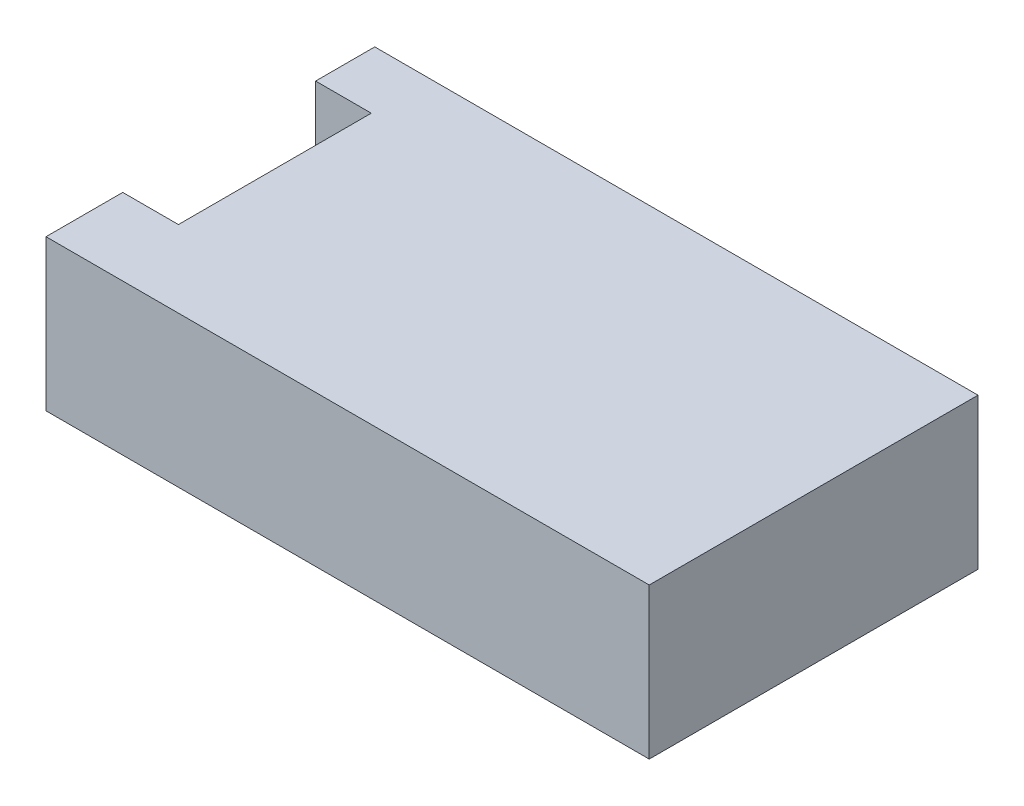
ISO-10303-21;
HEADER;
FILE_DESCRIPTION(('STEP AP214'),'2;1');
FILE_NAME('part.step','',(''),(''),'','','');
FILE_SCHEMA(('AUTOMOTIVE_DESIGN { 1 0 10303 214 1 1 1 1 }'));
ENDSEC;
DATA;
#1=APPLICATION_CONTEXT('core data for automotive mechanical design processes');
#2=APPLICATION_PROTOCOL_DEFINITION('international standard','automotive_design',2000,#1);
#3=PRODUCT_CONTEXT('',#1,'mechanical');
#4=PRODUCT('Part','Part','',(#3));
#5=PRODUCT_RELATED_PRODUCT_CATEGORY('part','',(#4));
#6=PRODUCT_DEFINITION_FORMATION('','',#4);
#7=PRODUCT_DEFINITION_CONTEXT('part definition',#1,'design');
#8=PRODUCT_DEFINITION('design','',#6,#7);
#9=PRODUCT_DEFINITION_SHAPE('','',#8);
#10=(LENGTH_UNIT() NAMED_UNIT(*) SI_UNIT(.MILLI.,.METRE.));
#11=(NAMED_UNIT(*) PLANE_ANGLE_UNIT() SI_UNIT($,.RADIAN.));
#12=(NAMED_UNIT(*) SI_UNIT($,.STERADIAN.) SOLID_ANGLE_UNIT());
#13=UNCERTAINTY_MEASURE_WITH_UNIT(LENGTH_MEASURE(1.E-05),#10,'distance_accuracy_value','');
#14=(GEOMETRIC_REPRESENTATION_CONTEXT(3) GLOBAL_UNCERTAINTY_ASSIGNED_CONTEXT((#13)) GLOBAL_UNIT_ASSIGNED_CONTEXT((#10,
#11,#12)) REPRESENTATION_CONTEXT('',''));
#15=CARTESIAN_POINT('',(0.,0.,0.));
#16=DIRECTION('',(0.,0.,1.));
#17=DIRECTION('',(1.,0.,0.));
#18=AXIS2_PLACEMENT_3D('',#15,#16,#17);
#19=CARTESIAN_POINT('',(13.048653616812,16.,14.7345241225469));
#20=DIRECTION('',(1.,0.,0.));
#21=DIRECTION('',(0.,0.,-1.));
#22=AXIS2_PLACEMENT_3D('',#19,#20,#21);
#23=PLANE('',#22);
#24=DIRECTION('',(0.,1.,0.));
#25=VECTOR('',#24,1.);
#26=CARTESIAN_POINT('',(13.048653616812,16.,68.1606571286871));
#27=LINE('',#26,#25);
#28=CARTESIAN_POINT('',(13.048653616812,16.,68.1606571286871));
#29=VERTEX_POINT('',#28);
#30=CARTESIAN_POINT('',(13.048653616812,21.,68.1606571286871));
#31=VERTEX_POINT('',#30);
#32=EDGE_CURVE('E230',#29,#31,#27,.T.);
#33=ORIENTED_EDGE('',*,*,#32,.F.);
#34=DIRECTION('',(0.,0.,-1.));
#35=VECTOR('',#34,1.);
#36=CARTESIAN_POINT('',(13.048653616812,16.,14.7345241225469));
#37=LINE('',#36,#35);
#38=CARTESIAN_POINT('',(13.048653616812,16.,78.6790460731446));
#39=VERTEX_POINT('',#38);
#40=EDGE_CURVE('E404',#39,#29,#37,.T.);
#41=ORIENTED_EDGE('',*,*,#40,.F.);
#42=DIRECTION('',(0.,1.,0.));
#43=VECTOR('',#42,1.);
#44=CARTESIAN_POINT('',(13.048653616812,16.,78.6790460731446));
#45=LINE('',#44,#43);
#46=CARTESIAN_POINT('',(13.048653616812,50.,78.6790460731446));
#47=VERTEX_POINT('',#46);
#48=EDGE_CURVE('E432',#39,#47,#45,.T.);
#49=ORIENTED_EDGE('',*,*,#48,.T.);
#50=DIRECTION('',(0.,0.,-1.));
#51=VECTOR('',#50,1.);
#52=CARTESIAN_POINT('',(13.048653616812,50.,14.7345241225469));
#53=LINE('',#52,#51);
#54=CARTESIAN_POINT('',(13.048653616812,50.,14.7345241225469));
#55=VERTEX_POINT('',#54);
#56=EDGE_CURVE('E417',#47,#55,#53,.T.);
#57=ORIENTED_EDGE('',*,*,#56,.T.);
#58=DIRECTION('',(0.,1.,0.));
#59=VECTOR('',#58,1.);
#60=CARTESIAN_POINT('',(13.048653616812,16.,14.7345241225469));
#61=LINE('',#60,#59);
#62=CARTESIAN_POINT('',(13.048653616812,16.,14.7345241225469));
#63=VERTEX_POINT('',#62);
#64=EDGE_CURVE('E429',#63,#55,#61,.T.);
#65=ORIENTED_EDGE('',*,*,#64,.F.);
#66=CARTESIAN_POINT('',(13.048653616812,16.,22.5222683426551));
#67=VERTEX_POINT('',#66);
#68=EDGE_CURVE('E403',#67,#63,#37,.T.);
#69=ORIENTED_EDGE('',*,*,#68,.F.);
#70=DIRECTION('',(0.,-1.,0.));
#71=VECTOR('',#70,1.);
#72=CARTESIAN_POINT('',(13.048653616812,16.,22.5222683426551));
#73=LINE('',#72,#71);
#74=CARTESIAN_POINT('',(13.048653616812,21.,22.5222683426551));
#75=VERTEX_POINT('',#74);
#76=EDGE_CURVE('E387',#75,#67,#73,.T.);
#77=ORIENTED_EDGE('',*,*,#76,.F.);
#78=DIRECTION('',(0.,0.,1.));
#79=VECTOR('',#78,1.);
#80=CARTESIAN_POINT('',(13.048653616812,21.,14.7345241225469));
#81=LINE('',#80,#79);
#82=CARTESIAN_POINT('',(13.048653616812,21.,28.1606571286872));
#83=VERTEX_POINT('',#82);
#84=EDGE_CURVE('E483',#75,#83,#81,.T.);
#85=ORIENTED_EDGE('',*,*,#84,.T.);
#86=DIRECTION('',(0.,1.,0.));
#87=VECTOR('',#86,1.);
#88=CARTESIAN_POINT('',(13.048653616812,16.,28.1606571286872));
#89=LINE('',#88,#87);
#90=CARTESIAN_POINT('',(13.048653616812,16.,28.1606571286872));
#91=VERTEX_POINT('',#90);
#92=EDGE_CURVE('E390',#91,#83,#89,.T.);
#93=ORIENTED_EDGE('',*,*,#92,.F.);
#94=CARTESIAN_POINT('',(13.048653616812,16.,32.5222683426551));
#95=VERTEX_POINT('',#94);
#96=EDGE_CURVE('E519',#95,#91,#37,.T.);
#97=ORIENTED_EDGE('',*,*,#96,.F.);
#98=DIRECTION('',(0.,-1.,0.));
#99=VECTOR('',#98,1.);
#100=CARTESIAN_POINT('',(13.048653616812,16.,32.5222683426551));
#101=LINE('',#100,#99);
#102=CARTESIAN_POINT('',(13.048653616812,21.,32.5222683426551));
#103=VERTEX_POINT('',#102);
#104=EDGE_CURVE('E357',#103,#95,#101,.T.);
#105=ORIENTED_EDGE('',*,*,#104,.F.);
#106=DIRECTION('',(0.,0.,1.));
#107=VECTOR('',#106,1.);
#108=CARTESIAN_POINT('',(13.048653616812,21.,14.7345241225469));
#109=LINE('',#108,#107);
#110=CARTESIAN_POINT('',(13.048653616812,21.,38.1606571286872));
#111=VERTEX_POINT('',#110);
#112=EDGE_CURVE('E487',#103,#111,#109,.T.);
#113=ORIENTED_EDGE('',*,*,#112,.T.);
#114=DIRECTION('',(0.,1.,0.));
#115=VECTOR('',#114,1.);
#116=CARTESIAN_POINT('',(13.048653616812,16.,38.1606571286872));
#117=LINE('',#116,#115);
#118=CARTESIAN_POINT('',(13.048653616812,16.,38.1606571286872));
#119=VERTEX_POINT('',#118);
#120=EDGE_CURVE('E361',#119,#111,#117,.T.);
#121=ORIENTED_EDGE('',*,*,#120,.F.);
#122=CARTESIAN_POINT('',(13.048653616812,16.,42.5222683426551));
#123=VERTEX_POINT('',#122);
#124=EDGE_CURVE('E514',#123,#119,#37,.T.);
#125=ORIENTED_EDGE('',*,*,#124,.F.);
#126=DIRECTION('',(0.,-1.,0.));
#127=VECTOR('',#126,1.);
#128=CARTESIAN_POINT('',(13.048653616812,16.,42.5222683426551));
#129=LINE('',#128,#127);
#130=CARTESIAN_POINT('',(13.048653616812,21.,42.5222683426551));
#131=VERTEX_POINT('',#130);
#132=EDGE_CURVE('E322',#131,#123,#129,.T.);
#133=ORIENTED_EDGE('',*,*,#132,.F.);
#134=DIRECTION('',(0.,0.,1.));
#135=VECTOR('',#134,1.);
#136=CARTESIAN_POINT('',(13.048653616812,21.,14.7345241225469));
#137=LINE('',#136,#135);
#138=CARTESIAN_POINT('',(13.048653616812,21.,48.1606571286872));
#139=VERTEX_POINT('',#138);
#140=EDGE_CURVE('E490',#131,#139,#137,.T.);
#141=ORIENTED_EDGE('',*,*,#140,.T.);
#142=DIRECTION('',(0.,1.,0.));
#143=VECTOR('',#142,1.);
#144=CARTESIAN_POINT('',(13.048653616812,16.,48.1606571286872));
#145=LINE('',#144,#143);
#146=CARTESIAN_POINT('',(13.048653616812,16.,48.1606571286872));
#147=VERTEX_POINT('',#146);
#148=EDGE_CURVE('E326',#147,#139,#145,.T.);
#149=ORIENTED_EDGE('',*,*,#148,.F.);
#150=CARTESIAN_POINT('',(13.048653616812,16.,52.5222683426551));
#151=VERTEX_POINT('',#150);
#152=EDGE_CURVE('E512',#151,#147,#37,.T.);
#153=ORIENTED_EDGE('',*,*,#152,.F.);
#154=DIRECTION('',(0.,-1.,0.));
#155=VECTOR('',#154,1.);
#156=CARTESIAN_POINT('',(13.048653616812,16.,52.5222683426551));
#157=LINE('',#156,#155);
#158=CARTESIAN_POINT('',(13.048653616812,21.,52.5222683426551));
#159=VERTEX_POINT('',#158);
#160=EDGE_CURVE('E287',#159,#151,#157,.T.);
#161=ORIENTED_EDGE('',*,*,#160,.F.);
#162=DIRECTION('',(0.,0.,1.));
#163=VECTOR('',#162,1.);
#164=CARTESIAN_POINT('',(13.048653616812,21.,14.7345241225469));
#165=LINE('',#164,#163);
#166=CARTESIAN_POINT('',(13.048653616812,21.,58.1606571286871));
#167=VERTEX_POINT('',#166);
#168=EDGE_CURVE('E50',#159,#167,#165,.T.);
#169=ORIENTED_EDGE('',*,*,#168,.T.);
#170=DIRECTION('',(0.,1.,0.));
#171=VECTOR('',#170,1.);
#172=CARTESIAN_POINT('',(13.048653616812,16.,58.1606571286871));
#173=LINE('',#172,#171);
#174=CARTESIAN_POINT('',(13.048653616812,16.,58.1606571286871));
#175=VERTEX_POINT('',#174);
#176=EDGE_CURVE('E291',#175,#167,#173,.T.);
#177=ORIENTED_EDGE('',*,*,#176,.F.);
#178=CARTESIAN_POINT('',(13.048653616812,16.,62.5222683426551));
#179=VERTEX_POINT('',#178);
#180=EDGE_CURVE('E409',#179,#175,#37,.T.);
#181=ORIENTED_EDGE('',*,*,#180,.F.);
#182=DIRECTION('',(0.,-1.,0.));
#183=VECTOR('',#182,1.);
#184=CARTESIAN_POINT('',(13.048653616812,16.,62.5222683426551));
#185=LINE('',#184,#183);
#186=CARTESIAN_POINT('',(13.048653616812,21.,62.5222683426551));
#187=VERTEX_POINT('',#186);
#188=EDGE_CURVE('E60',#187,#179,#185,.T.);
#189=ORIENTED_EDGE('',*,*,#188,.F.);
#190=DIRECTION('',(0.,0.,1.));
#191=VECTOR('',#190,1.);
#192=CARTESIAN_POINT('',(13.048653616812,21.,14.7345241225469));
#193=LINE('',#192,#191);
#194=EDGE_CURVE('E11',#187,#31,#193,.T.);
#195=ORIENTED_EDGE('',*,*,#194,.T.);
#196=EDGE_LOOP('',(#33,#41,#49,#57,#65,#69,#77,#85,#93,#97,#105,#113,#121,#125,#133,#141,#149,
#153,#161,#169,#177,#181,#189,#195));
#197=FACE_BOUND('',#196,.T.);
#198=ADVANCED_FACE('F41',(#197),#23,.F.);
#199=CARTESIAN_POINT('',(0.,16.,0.));
#200=DIRECTION('',(0.,1.,0.));
#201=DIRECTION('',(0.,0.,1.));
#202=AXIS2_PLACEMENT_3D('',#199,#200,#201);
#203=PLANE('',#202);
#204=ORIENTED_EDGE('',*,*,#40,.T.);
#205=DIRECTION('',(1.,0.,0.));
#206=VECTOR('',#205,1.);
#207=CARTESIAN_POINT('',(-5.4120267260579,16.,68.1606571286871));
#208=LINE('',#207,#206);
#209=CARTESIAN_POINT('',(-5.4120267260579,16.,68.1606571286871));
#210=VERTEX_POINT('',#209);
#211=EDGE_CURVE('E567',#210,#29,#208,.T.);
#212=ORIENTED_EDGE('',*,*,#211,.F.);
#213=DIRECTION('',(0.,0.,1.));
#214=VECTOR('',#213,1.);
#215=CARTESIAN_POINT('',(-5.4120267260579,16.,14.7345241225469));
#216=LINE('',#215,#214);
#217=CARTESIAN_POINT('',(-5.4120267260579,16.,78.6790460731446));
#218=VERTEX_POINT('',#217);
#219=EDGE_CURVE('E247',#210,#218,#216,.T.);
#220=ORIENTED_EDGE('',*,*,#219,.T.);
#221=DIRECTION('',(1.,0.,0.));
#222=VECTOR('',#221,1.);
#223=CARTESIAN_POINT('',(-5.4120267260579,16.,78.6790460731446));
#224=LINE('',#223,#222);
#225=EDGE_CURVE('E398',#218,#39,#224,.T.);
#226=ORIENTED_EDGE('',*,*,#225,.T.);
#227=EDGE_LOOP('',(#204,#212,#220,#226));
#228=FACE_BOUND('',#227,.T.);
#229=ADVANCED_FACE('F566',(#228),#203,.T.);
#230=CARTESIAN_POINT('',(-5.4120267260579,16.,58.1606571286871));
#231=VERTEX_POINT('',#230);
#232=CARTESIAN_POINT('',(-5.4120267260579,16.,62.5222683426551));
#233=VERTEX_POINT('',#232);
#234=EDGE_CURVE('E505',#231,#233,#216,.T.);
#235=ORIENTED_EDGE('',*,*,#234,.T.);
#236=DIRECTION('',(-1.,0.,0.));
#237=VECTOR('',#236,1.);
#238=CARTESIAN_POINT('',(-5.4120267260579,16.,62.5222683426551));
#239=LINE('',#238,#237);
#240=EDGE_CURVE('E243',#179,#233,#239,.T.);
#241=ORIENTED_EDGE('',*,*,#240,.F.);
#242=ORIENTED_EDGE('',*,*,#180,.T.);
#243=DIRECTION('',(1.,0.,0.));
#244=VECTOR('',#243,1.);
#245=CARTESIAN_POINT('',(-5.4120267260579,16.,58.1606571286871));
#246=LINE('',#245,#244);
#247=EDGE_CURVE('E260',#231,#175,#246,.T.);
#248=ORIENTED_EDGE('',*,*,#247,.F.);
#249=EDGE_LOOP('',(#235,#241,#242,#248));
#250=FACE_BOUND('',#249,.T.);
#251=ADVANCED_FACE('F510',(#250),#203,.T.);
#252=CARTESIAN_POINT('',(-5.4120267260579,16.,48.1606571286872));
#253=VERTEX_POINT('',#252);
#254=CARTESIAN_POINT('',(-5.4120267260579,16.,52.5222683426551));
#255=VERTEX_POINT('',#254);
#256=EDGE_CURVE('E509',#253,#255,#216,.T.);
#257=ORIENTED_EDGE('',*,*,#256,.T.);
#258=DIRECTION('',(-1.,0.,0.));
#259=VECTOR('',#258,1.);
#260=CARTESIAN_POINT('',(-5.4120267260579,16.,52.5222683426551));
#261=LINE('',#260,#259);
#262=EDGE_CURVE('E266',#151,#255,#261,.T.);
#263=ORIENTED_EDGE('',*,*,#262,.F.);
#264=ORIENTED_EDGE('',*,*,#152,.T.);
#265=DIRECTION('',(1.,0.,0.));
#266=VECTOR('',#265,1.);
#267=CARTESIAN_POINT('',(-5.4120267260579,16.,48.1606571286872));
#268=LINE('',#267,#266);
#269=EDGE_CURVE('E295',#253,#147,#268,.T.);
#270=ORIENTED_EDGE('',*,*,#269,.F.);
#271=EDGE_LOOP('',(#257,#263,#264,#270));
#272=FACE_BOUND('',#271,.T.);
#273=ADVANCED_FACE('F599',(#272),#203,.T.);
#274=CARTESIAN_POINT('',(-5.4120267260579,16.,38.1606571286872));
#275=VERTEX_POINT('',#274);
#276=CARTESIAN_POINT('',(-5.4120267260579,16.,42.5222683426551));
#277=VERTEX_POINT('',#276);
#278=EDGE_CURVE('E571',#275,#277,#216,.T.);
#279=ORIENTED_EDGE('',*,*,#278,.T.);
#280=DIRECTION('',(-1.,0.,0.));
#281=VECTOR('',#280,1.);
#282=CARTESIAN_POINT('',(-5.4120267260579,16.,42.5222683426551));
#283=LINE('',#282,#281);
#284=EDGE_CURVE('E301',#123,#277,#283,.T.);
#285=ORIENTED_EDGE('',*,*,#284,.F.);
#286=ORIENTED_EDGE('',*,*,#124,.T.);
#287=DIRECTION('',(1.,0.,0.));
#288=VECTOR('',#287,1.);
#289=CARTESIAN_POINT('',(-5.4120267260579,16.,38.1606571286872));
#290=LINE('',#289,#288);
#291=EDGE_CURVE('E330',#275,#119,#290,.T.);
#292=ORIENTED_EDGE('',*,*,#291,.F.);
#293=EDGE_LOOP('',(#279,#285,#286,#292));
#294=FACE_BOUND('',#293,.T.);
#295=ADVANCED_FACE('F587',(#294),#203,.T.);
#296=CARTESIAN_POINT('',(-5.4120267260579,16.,28.1606571286872));
#297=VERTEX_POINT('',#296);
#298=CARTESIAN_POINT('',(-5.4120267260579,16.,32.5222683426551));
#299=VERTEX_POINT('',#298);
#300=EDGE_CURVE('E399',#297,#299,#216,.T.);
#301=ORIENTED_EDGE('',*,*,#300,.T.);
#302=DIRECTION('',(-1.,0.,0.));
#303=VECTOR('',#302,1.);
#304=CARTESIAN_POINT('',(-5.4120267260579,16.,32.5222683426551));
#305=LINE('',#304,#303);
#306=EDGE_CURVE('E336',#95,#299,#305,.T.);
#307=ORIENTED_EDGE('',*,*,#306,.F.);
#308=ORIENTED_EDGE('',*,*,#96,.T.);
#309=DIRECTION('',(1.,0.,0.));
#310=VECTOR('',#309,1.);
#311=CARTESIAN_POINT('',(-5.4120267260579,16.,28.1606571286872));
#312=LINE('',#311,#310);
#313=EDGE_CURVE('E365',#297,#91,#312,.T.);
#314=ORIENTED_EDGE('',*,*,#313,.F.);
#315=EDGE_LOOP('',(#301,#307,#308,#314));
#316=FACE_BOUND('',#315,.T.);
#317=ADVANCED_FACE('F574',(#316),#203,.T.);
#318=CARTESIAN_POINT('',(-5.4120267260579,16.,14.7345241225469));
#319=VERTEX_POINT('',#318);
#320=CARTESIAN_POINT('',(-5.4120267260579,16.,22.5222683426551));
#321=VERTEX_POINT('',#320);
#322=EDGE_CURVE('E394',#319,#321,#216,.T.);
#323=ORIENTED_EDGE('',*,*,#322,.T.);
#324=DIRECTION('',(1.,0.,0.));
#325=VECTOR('',#324,1.);
#326=CARTESIAN_POINT('',(0.,16.,22.5222683426551));
#327=LINE('',#326,#325);
#328=EDGE_CURVE('E479',#321,#67,#327,.T.);
#329=ORIENTED_EDGE('',*,*,#328,.T.);
#330=ORIENTED_EDGE('',*,*,#68,.T.);
#331=DIRECTION('',(-1.,0.,0.));
#332=VECTOR('',#331,1.);
#333=CARTESIAN_POINT('',(-5.4120267260579,16.,14.7345241225469));
#334=LINE('',#333,#332);
#335=EDGE_CURVE('E408',#63,#319,#334,.T.);
#336=ORIENTED_EDGE('',*,*,#335,.T.);
#337=EDGE_LOOP('',(#323,#329,#330,#336));
#338=FACE_BOUND('',#337,.T.);
#339=ADVANCED_FACE('F532',(#338),#203,.T.);
#340=CARTESIAN_POINT('',(-5.41202672605791,50.,-4.87750556792871));
#341=DIRECTION('',(1.,0.,0.));
#342=DIRECTION('',(0.,0.,-1.));
#343=AXIS2_PLACEMENT_3D('',#340,#341,#342);
#344=PLANE('',#343);
#345=ORIENTED_EDGE('',*,*,#322,.F.);
#346=DIRECTION('',(0.,1.,0.));
#347=VECTOR('',#346,1.);
#348=CARTESIAN_POINT('',(-5.4120267260579,16.,14.7345241225469));
#349=LINE('',#348,#347);
#350=CARTESIAN_POINT('',(-5.4120267260579,50.,14.7345241225469));
#351=VERTEX_POINT('',#350);
#352=EDGE_CURVE('E424',#319,#351,#349,.T.);
#353=ORIENTED_EDGE('',*,*,#352,.T.);
#354=DIRECTION('',(0.,0.,1.));
#355=VECTOR('',#354,1.);
#356=CARTESIAN_POINT('',(-5.41202672605791,50.,-4.87750556792871));
#357=LINE('',#356,#355);
#358=CARTESIAN_POINT('',(-5.41202672605791,50.,-4.87750556792871));
#359=VERTEX_POINT('',#358);
#360=EDGE_CURVE('E437',#359,#351,#357,.T.);
#361=ORIENTED_EDGE('',*,*,#360,.F.);
#362=DIRECTION('',(0.,-1.,0.));
#363=VECTOR('',#362,1.);
#364=CARTESIAN_POINT('',(-5.41202672605791,50.,-4.87750556792871));
#365=LINE('',#364,#363);
#366=CARTESIAN_POINT('',(-5.41202672605791,0.,-4.87750556792871));
#367=VERTEX_POINT('',#366);
#368=EDGE_CURVE('E451',#359,#367,#365,.T.);
#369=ORIENTED_EDGE('',*,*,#368,.T.);
#370=DIRECTION('',(0.,0.,1.));
#371=VECTOR('',#370,1.);
#372=CARTESIAN_POINT('',(-5.41202672605791,0.,-4.87750556792871));
#373=LINE('',#372,#371);
#374=CARTESIAN_POINT('',(-5.41202672605789,0.,104.122494432071));
#375=VERTEX_POINT('',#374);
#376=EDGE_CURVE('E428',#367,#375,#373,.T.);
#377=ORIENTED_EDGE('',*,*,#376,.T.);
#378=DIRECTION('',(0.,-1.,0.));
#379=VECTOR('',#378,1.);
#380=CARTESIAN_POINT('',(-5.41202672605789,50.,104.122494432071));
#381=LINE('',#380,#379);
#382=CARTESIAN_POINT('',(-5.41202672605789,50.,104.122494432071));
#383=VERTEX_POINT('',#382);
#384=EDGE_CURVE('E475',#383,#375,#381,.T.);
#385=ORIENTED_EDGE('',*,*,#384,.F.);
#386=CARTESIAN_POINT('',(-5.4120267260579,50.,78.6790460731446));
#387=VERTEX_POINT('',#386);
#388=EDGE_CURVE('E442',#387,#383,#357,.T.);
#389=ORIENTED_EDGE('',*,*,#388,.F.);
#390=DIRECTION('',(0.,1.,0.));
#391=VECTOR('',#390,1.);
#392=CARTESIAN_POINT('',(-5.4120267260579,16.,78.6790460731446));
#393=LINE('',#392,#391);
#394=EDGE_CURVE('E413',#218,#387,#393,.T.);
#395=ORIENTED_EDGE('',*,*,#394,.F.);
#396=ORIENTED_EDGE('',*,*,#219,.F.);
#397=DIRECTION('',(0.,-1.,0.));
#398=VECTOR('',#397,1.);
#399=CARTESIAN_POINT('',(-5.4120267260579,21.,68.1606571286871));
#400=LINE('',#399,#398);
#401=CARTESIAN_POINT('',(-5.4120267260579,21.,68.1606571286871));
#402=VERTEX_POINT('',#401);
#403=EDGE_CURVE('E229',#402,#210,#400,.T.);
#404=ORIENTED_EDGE('',*,*,#403,.F.);
#405=DIRECTION('',(0.,0.,1.));
#406=VECTOR('',#405,1.);
#407=CARTESIAN_POINT('',(-5.4120267260579,21.,62.5222683426551));
#408=LINE('',#407,#406);
#409=CARTESIAN_POINT('',(-5.4120267260579,21.,62.5222683426551));
#410=VERTEX_POINT('',#409);
#411=EDGE_CURVE('E234',#410,#402,#408,.T.);
#412=ORIENTED_EDGE('',*,*,#411,.F.);
#413=DIRECTION('',(0.,-1.,0.));
#414=VECTOR('',#413,1.);
#415=CARTESIAN_POINT('',(-5.4120267260579,21.,62.5222683426551));
#416=LINE('',#415,#414);
#417=EDGE_CURVE('E250',#410,#233,#416,.T.);
#418=ORIENTED_EDGE('',*,*,#417,.T.);
#419=ORIENTED_EDGE('',*,*,#234,.F.);
#420=DIRECTION('',(0.,-1.,0.));
#421=VECTOR('',#420,1.);
#422=CARTESIAN_POINT('',(-5.4120267260579,21.,58.1606571286871));
#423=LINE('',#422,#421);
#424=CARTESIAN_POINT('',(-5.4120267260579,21.,58.1606571286871));
#425=VERTEX_POINT('',#424);
#426=EDGE_CURVE('E283',#425,#231,#423,.T.);
#427=ORIENTED_EDGE('',*,*,#426,.F.);
#428=DIRECTION('',(0.,0.,1.));
#429=VECTOR('',#428,1.);
#430=CARTESIAN_POINT('',(-5.4120267260579,21.,52.5222683426551));
#431=LINE('',#430,#429);
#432=CARTESIAN_POINT('',(-5.4120267260579,21.,52.5222683426551));
#433=VERTEX_POINT('',#432);
#434=EDGE_CURVE('E261',#433,#425,#431,.T.);
#435=ORIENTED_EDGE('',*,*,#434,.F.);
#436=DIRECTION('',(0.,-1.,0.));
#437=VECTOR('',#436,1.);
#438=CARTESIAN_POINT('',(-5.4120267260579,21.,52.5222683426551));
#439=LINE('',#438,#437);
#440=EDGE_CURVE('E273',#433,#255,#439,.T.);
#441=ORIENTED_EDGE('',*,*,#440,.T.);
#442=ORIENTED_EDGE('',*,*,#256,.F.);
#443=DIRECTION('',(0.,-1.,0.));
#444=VECTOR('',#443,1.);
#445=CARTESIAN_POINT('',(-5.4120267260579,21.,48.1606571286872));
#446=LINE('',#445,#444);
#447=CARTESIAN_POINT('',(-5.4120267260579,21.,48.1606571286872));
#448=VERTEX_POINT('',#447);
#449=EDGE_CURVE('E318',#448,#253,#446,.T.);
#450=ORIENTED_EDGE('',*,*,#449,.F.);
#451=DIRECTION('',(0.,0.,1.));
#452=VECTOR('',#451,1.);
#453=CARTESIAN_POINT('',(-5.4120267260579,21.,42.5222683426551));
#454=LINE('',#453,#452);
#455=CARTESIAN_POINT('',(-5.4120267260579,21.,42.5222683426551));
#456=VERTEX_POINT('',#455);
#457=EDGE_CURVE('E296',#456,#448,#454,.T.);
#458=ORIENTED_EDGE('',*,*,#457,.F.);
#459=DIRECTION('',(0.,-1.,0.));
#460=VECTOR('',#459,1.);
#461=CARTESIAN_POINT('',(-5.4120267260579,21.,42.5222683426551));
#462=LINE('',#461,#460);
#463=EDGE_CURVE('E308',#456,#277,#462,.T.);
#464=ORIENTED_EDGE('',*,*,#463,.T.);
#465=ORIENTED_EDGE('',*,*,#278,.F.);
#466=DIRECTION('',(0.,-1.,0.));
#467=VECTOR('',#466,1.);
#468=CARTESIAN_POINT('',(-5.4120267260579,21.,38.1606571286872));
#469=LINE('',#468,#467);
#470=CARTESIAN_POINT('',(-5.4120267260579,21.,38.1606571286872));
#471=VERTEX_POINT('',#470);
#472=EDGE_CURVE('E353',#471,#275,#469,.T.);
#473=ORIENTED_EDGE('',*,*,#472,.F.);
#474=DIRECTION('',(0.,0.,1.));
#475=VECTOR('',#474,1.);
#476=CARTESIAN_POINT('',(-5.4120267260579,21.,32.5222683426551));
#477=LINE('',#476,#475);
#478=CARTESIAN_POINT('',(-5.4120267260579,21.,32.5222683426551));
#479=VERTEX_POINT('',#478);
#480=EDGE_CURVE('E331',#479,#471,#477,.T.);
#481=ORIENTED_EDGE('',*,*,#480,.F.);
#482=DIRECTION('',(0.,-1.,0.));
#483=VECTOR('',#482,1.);
#484=CARTESIAN_POINT('',(-5.4120267260579,21.,32.5222683426551));
#485=LINE('',#484,#483);
#486=EDGE_CURVE('E343',#479,#299,#485,.T.);
#487=ORIENTED_EDGE('',*,*,#486,.T.);
#488=ORIENTED_EDGE('',*,*,#300,.F.);
#489=DIRECTION('',(0.,-1.,0.));
#490=VECTOR('',#489,1.);
#491=CARTESIAN_POINT('',(-5.4120267260579,21.,28.1606571286872));
#492=LINE('',#491,#490);
#493=CARTESIAN_POINT('',(-5.4120267260579,21.,28.1606571286872));
#494=VERTEX_POINT('',#493);
#495=EDGE_CURVE('E384',#494,#297,#492,.T.);
#496=ORIENTED_EDGE('',*,*,#495,.F.);
#497=DIRECTION('',(0.,0.,1.));
#498=VECTOR('',#497,1.);
#499=CARTESIAN_POINT('',(-5.4120267260579,21.,22.5222683426551));
#500=LINE('',#499,#498);
#501=CARTESIAN_POINT('',(-5.4120267260579,21.,22.5222683426551));
#502=VERTEX_POINT('',#501);
#503=EDGE_CURVE('E366',#502,#494,#500,.T.);
#504=ORIENTED_EDGE('',*,*,#503,.F.);
#505=DIRECTION('',(0.,-1.,0.));
#506=VECTOR('',#505,1.);
#507=CARTESIAN_POINT('',(-5.4120267260579,21.,22.5222683426551));
#508=LINE('',#507,#506);
#509=EDGE_CURVE('E377',#502,#321,#508,.T.);
#510=ORIENTED_EDGE('',*,*,#509,.T.);
#511=EDGE_LOOP('',(#345,#353,#361,#369,#377,#385,#389,#395,#396,#404,#412,#418,#419,#427,#435,
#441,#442,#450,#458,#464,#465,#473,#481,#487,#488,#496,#504,#510));
#512=FACE_BOUND('',#511,.T.);
#513=ADVANCED_FACE('F43',(#512),#344,.F.);
#514=CARTESIAN_POINT('',(-5.41202672605789,50.,104.122494432071));
#515=DIRECTION('',(0.,0.,-1.));
#516=DIRECTION('',(-1.,0.,0.));
#517=AXIS2_PLACEMENT_3D('',#514,#515,#516);
#518=PLANE('',#517);
#519=DIRECTION('',(1.,0.,0.));
#520=VECTOR('',#519,1.);
#521=CARTESIAN_POINT('',(-5.41202672605789,0.,104.122494432071));
#522=LINE('',#521,#520);
#523=CARTESIAN_POINT('',(194.587973273942,0.,104.122494432071));
#524=VERTEX_POINT('',#523);
#525=EDGE_CURVE('E455',#375,#524,#522,.T.);
#526=ORIENTED_EDGE('',*,*,#525,.T.);
#527=DIRECTION('',(0.,-1.,0.));
#528=VECTOR('',#527,1.);
#529=CARTESIAN_POINT('',(194.587973273942,50.,104.122494432071));
#530=LINE('',#529,#528);
#531=CARTESIAN_POINT('',(194.587973273942,50.,104.122494432071));
#532=VERTEX_POINT('',#531);
#533=EDGE_CURVE('E471',#532,#524,#530,.T.);
#534=ORIENTED_EDGE('',*,*,#533,.F.);
#535=DIRECTION('',(1.,0.,0.));
#536=VECTOR('',#535,1.);
#537=CARTESIAN_POINT('',(-5.41202672605789,50.,104.122494432071));
#538=LINE('',#537,#536);
#539=EDGE_CURVE('E441',#383,#532,#538,.T.);
#540=ORIENTED_EDGE('',*,*,#539,.F.);
#541=ORIENTED_EDGE('',*,*,#384,.T.);
#542=EDGE_LOOP('',(#526,#534,#540,#541));
#543=FACE_BOUND('',#542,.T.);
#544=ADVANCED_FACE('F557',(#543),#518,.F.);
#545=CARTESIAN_POINT('',(194.587973273942,50.,-4.87750556792871));
#546=DIRECTION('',(-1.,0.,0.));
#547=DIRECTION('',(0.,0.,1.));
#548=AXIS2_PLACEMENT_3D('',#545,#546,#547);
#549=PLANE('',#548);
#550=DIRECTION('',(0.,0.,-1.));
#551=VECTOR('',#550,1.);
#552=CARTESIAN_POINT('',(194.587973273942,0.,-4.87750556792871));
#553=LINE('',#552,#551);
#554=CARTESIAN_POINT('',(194.587973273942,0.,-4.87750556792871));
#555=VERTEX_POINT('',#554);
#556=EDGE_CURVE('E458',#524,#555,#553,.T.);
#557=ORIENTED_EDGE('',*,*,#556,.T.);
#558=DIRECTION('',(0.,-1.,0.));
#559=VECTOR('',#558,1.);
#560=CARTESIAN_POINT('',(194.587973273942,50.,-4.87750556792871));
#561=LINE('',#560,#559);
#562=CARTESIAN_POINT('',(194.587973273942,50.,-4.87750556792871));
#563=VERTEX_POINT('',#562);
#564=EDGE_CURVE('E467',#563,#555,#561,.T.);
#565=ORIENTED_EDGE('',*,*,#564,.F.);
#566=DIRECTION('',(0.,0.,-1.));
#567=VECTOR('',#566,1.);
#568=CARTESIAN_POINT('',(194.587973273942,50.,-4.87750556792871));
#569=LINE('',#568,#567);
#570=EDGE_CURVE('E445',#532,#563,#569,.T.);
#571=ORIENTED_EDGE('',*,*,#570,.F.);
#572=ORIENTED_EDGE('',*,*,#533,.T.);
#573=EDGE_LOOP('',(#557,#565,#571,#572));
#574=FACE_BOUND('',#573,.T.);
#575=ADVANCED_FACE('F628',(#574),#549,.F.);
#576=CARTESIAN_POINT('',(-5.41202672605791,50.,-4.87750556792871));
#577=DIRECTION('',(0.,0.,1.));
#578=DIRECTION('',(1.,0.,0.));
#579=AXIS2_PLACEMENT_3D('',#576,#577,#578);
#580=PLANE('',#579);
#581=DIRECTION('',(-1.,0.,0.));
#582=VECTOR('',#581,1.);
#583=CARTESIAN_POINT('',(-5.41202672605791,0.,-4.87750556792871));
#584=LINE('',#583,#582);
#585=EDGE_CURVE('E461',#555,#367,#584,.T.);
#586=ORIENTED_EDGE('',*,*,#585,.T.);
#587=ORIENTED_EDGE('',*,*,#368,.F.);
#588=DIRECTION('',(-1.,0.,0.));
#589=VECTOR('',#588,1.);
#590=CARTESIAN_POINT('',(-5.41202672605791,50.,-4.87750556792871));
#591=LINE('',#590,#589);
#592=EDGE_CURVE('E448',#563,#359,#591,.T.);
#593=ORIENTED_EDGE('',*,*,#592,.F.);
#594=ORIENTED_EDGE('',*,*,#564,.T.);
#595=EDGE_LOOP('',(#586,#587,#593,#594));
#596=FACE_BOUND('',#595,.T.);
#597=ADVANCED_FACE('F547',(#596),#580,.F.);
#598=CARTESIAN_POINT('',(0.,50.,0.));
#599=DIRECTION('',(0.,1.,0.));
#600=DIRECTION('',(0.,0.,1.));
#601=AXIS2_PLACEMENT_3D('',#598,#599,#600);
#602=PLANE('',#601);
#603=DIRECTION('',(-1.,0.,0.));
#604=VECTOR('',#603,1.);
#605=CARTESIAN_POINT('',(-5.4120267260579,50.,14.7345241225469));
#606=LINE('',#605,#604);
#607=EDGE_CURVE('E421',#55,#351,#606,.T.);
#608=ORIENTED_EDGE('',*,*,#607,.F.);
#609=ORIENTED_EDGE('',*,*,#56,.F.);
#610=DIRECTION('',(1.,0.,0.));
#611=VECTOR('',#610,1.);
#612=CARTESIAN_POINT('',(-5.4120267260579,50.,78.6790460731446));
#613=LINE('',#612,#611);
#614=EDGE_CURVE('E393',#387,#47,#613,.T.);
#615=ORIENTED_EDGE('',*,*,#614,.F.);
#616=ORIENTED_EDGE('',*,*,#388,.T.);
#617=ORIENTED_EDGE('',*,*,#539,.T.);
#618=ORIENTED_EDGE('',*,*,#570,.T.);
#619=ORIENTED_EDGE('',*,*,#592,.T.);
#620=ORIENTED_EDGE('',*,*,#360,.T.);
#621=EDGE_LOOP('',(#608,#609,#615,#616,#617,#618,#619,#620));
#622=FACE_BOUND('',#621,.T.);
#623=ADVANCED_FACE('F541',(#622),#602,.T.);
#624=CARTESIAN_POINT('',(0.,0.,0.));
#625=DIRECTION('',(0.,1.,0.));
#626=DIRECTION('',(0.,0.,1.));
#627=AXIS2_PLACEMENT_3D('',#624,#625,#626);
#628=PLANE('',#627);
#629=ORIENTED_EDGE('',*,*,#376,.F.);
#630=ORIENTED_EDGE('',*,*,#585,.F.);
#631=ORIENTED_EDGE('',*,*,#556,.F.);
#632=ORIENTED_EDGE('',*,*,#525,.F.);
#633=EDGE_LOOP('',(#629,#630,#631,#632));
#634=FACE_BOUND('',#633,.T.);
#635=ADVANCED_FACE('F552',(#634),#628,.F.);
#636=CARTESIAN_POINT('',(-5.4120267260579,16.,14.7345241225469));
#637=DIRECTION('',(0.,0.,-1.));
#638=DIRECTION('',(-1.,0.,0.));
#639=AXIS2_PLACEMENT_3D('',#636,#637,#638);
#640=PLANE('',#639);
#641=ORIENTED_EDGE('',*,*,#607,.T.);
#642=ORIENTED_EDGE('',*,*,#352,.F.);
#643=ORIENTED_EDGE('',*,*,#335,.F.);
#644=ORIENTED_EDGE('',*,*,#64,.T.);
#645=EDGE_LOOP('',(#641,#642,#643,#644));
#646=FACE_BOUND('',#645,.T.);
#647=ADVANCED_FACE('F538',(#646),#640,.F.);
#648=CARTESIAN_POINT('',(-5.4120267260579,16.,78.6790460731446));
#649=DIRECTION('',(0.,0.,1.));
#650=DIRECTION('',(1.,0.,0.));
#651=AXIS2_PLACEMENT_3D('',#648,#649,#650);
#652=PLANE('',#651);
#653=ORIENTED_EDGE('',*,*,#614,.T.);
#654=ORIENTED_EDGE('',*,*,#48,.F.);
#655=ORIENTED_EDGE('',*,*,#225,.F.);
#656=ORIENTED_EDGE('',*,*,#394,.T.);
#657=EDGE_LOOP('',(#653,#654,#655,#656));
#658=FACE_BOUND('',#657,.T.);
#659=ADVANCED_FACE('F562',(#658),#652,.F.);
#660=CARTESIAN_POINT('',(0.,21.,0.));
#661=DIRECTION('',(0.,1.,0.));
#662=DIRECTION('',(0.,0.,1.));
#663=AXIS2_PLACEMENT_3D('',#660,#661,#662);
#664=PLANE('',#663);
#665=ORIENTED_EDGE('',*,*,#84,.F.);
#666=DIRECTION('',(-1.,0.,0.));
#667=VECTOR('',#666,1.);
#668=CARTESIAN_POINT('',(-5.4120267260579,21.,22.5222683426551));
#669=LINE('',#668,#667);
#670=EDGE_CURVE('E374',#75,#502,#669,.T.);
#671=ORIENTED_EDGE('',*,*,#670,.T.);
#672=ORIENTED_EDGE('',*,*,#503,.T.);
#673=DIRECTION('',(1.,0.,0.));
#674=VECTOR('',#673,1.);
#675=CARTESIAN_POINT('',(-5.4120267260579,21.,28.1606571286872));
#676=LINE('',#675,#674);
#677=EDGE_CURVE('E370',#494,#83,#676,.T.);
#678=ORIENTED_EDGE('',*,*,#677,.T.);
#679=EDGE_LOOP('',(#665,#671,#672,#678));
#680=FACE_BOUND('',#679,.T.);
#681=ADVANCED_FACE('F621',(#680),#664,.T.);
#682=CARTESIAN_POINT('',(-5.4120267260579,21.,28.1606571286872));
#683=DIRECTION('',(0.,0.,-1.));
#684=DIRECTION('',(-1.,0.,0.));
#685=AXIS2_PLACEMENT_3D('',#682,#683,#684);
#686=PLANE('',#685);
#687=ORIENTED_EDGE('',*,*,#313,.T.);
#688=ORIENTED_EDGE('',*,*,#92,.T.);
#689=ORIENTED_EDGE('',*,*,#677,.F.);
#690=ORIENTED_EDGE('',*,*,#495,.T.);
#691=EDGE_LOOP('',(#687,#688,#689,#690));
#692=FACE_BOUND('',#691,.T.);
#693=ADVANCED_FACE('F642',(#692),#686,.F.);
#694=CARTESIAN_POINT('',(-5.4120267260579,21.,22.5222683426551));
#695=DIRECTION('',(0.,0.,1.));
#696=DIRECTION('',(1.,0.,0.));
#697=AXIS2_PLACEMENT_3D('',#694,#695,#696);
#698=PLANE('',#697);
#699=ORIENTED_EDGE('',*,*,#670,.F.);
#700=ORIENTED_EDGE('',*,*,#76,.T.);
#701=ORIENTED_EDGE('',*,*,#328,.F.);
#702=ORIENTED_EDGE('',*,*,#509,.F.);
#703=EDGE_LOOP('',(#699,#700,#701,#702));
#704=FACE_BOUND('',#703,.T.);
#705=ADVANCED_FACE('F645',(#704),#698,.F.);
#706=CARTESIAN_POINT('',(0.,21.,10.));
#707=DIRECTION('',(0.,1.,0.));
#708=DIRECTION('',(0.,0.,1.));
#709=AXIS2_PLACEMENT_3D('',#706,#707,#708);
#710=PLANE('',#709);
#711=ORIENTED_EDGE('',*,*,#112,.F.);
#712=DIRECTION('',(-1.,0.,0.));
#713=VECTOR('',#712,1.);
#714=CARTESIAN_POINT('',(-5.4120267260579,21.,32.5222683426551));
#715=LINE('',#714,#713);
#716=EDGE_CURVE('E340',#103,#479,#715,.T.);
#717=ORIENTED_EDGE('',*,*,#716,.T.);
#718=ORIENTED_EDGE('',*,*,#480,.T.);
#719=DIRECTION('',(1.,0.,0.));
#720=VECTOR('',#719,1.);
#721=CARTESIAN_POINT('',(-5.4120267260579,21.,38.1606571286872));
#722=LINE('',#721,#720);
#723=EDGE_CURVE('E335',#471,#111,#722,.T.);
#724=ORIENTED_EDGE('',*,*,#723,.T.);
#725=EDGE_LOOP('',(#711,#717,#718,#724));
#726=FACE_BOUND('',#725,.T.);
#727=ADVANCED_FACE('F584',(#726),#710,.T.);
#728=CARTESIAN_POINT('',(-5.4120267260579,21.,38.1606571286872));
#729=DIRECTION('',(0.,0.,-1.));
#730=DIRECTION('',(-1.,0.,0.));
#731=AXIS2_PLACEMENT_3D('',#728,#729,#730);
#732=PLANE('',#731);
#733=ORIENTED_EDGE('',*,*,#291,.T.);
#734=ORIENTED_EDGE('',*,*,#120,.T.);
#735=ORIENTED_EDGE('',*,*,#723,.F.);
#736=ORIENTED_EDGE('',*,*,#472,.T.);
#737=EDGE_LOOP('',(#733,#734,#735,#736));
#738=FACE_BOUND('',#737,.T.);
#739=ADVANCED_FACE('F586',(#738),#732,.F.);
#740=CARTESIAN_POINT('',(-5.4120267260579,21.,32.5222683426551));
#741=DIRECTION('',(0.,0.,1.));
#742=DIRECTION('',(1.,0.,0.));
#743=AXIS2_PLACEMENT_3D('',#740,#741,#742);
#744=PLANE('',#743);
#745=ORIENTED_EDGE('',*,*,#716,.F.);
#746=ORIENTED_EDGE('',*,*,#104,.T.);
#747=ORIENTED_EDGE('',*,*,#306,.T.);
#748=ORIENTED_EDGE('',*,*,#486,.F.);
#749=EDGE_LOOP('',(#745,#746,#747,#748));
#750=FACE_BOUND('',#749,.T.);
#751=ADVANCED_FACE('F579',(#750),#744,.F.);
#752=CARTESIAN_POINT('',(0.,21.,20.));
#753=DIRECTION('',(0.,1.,0.));
#754=DIRECTION('',(0.,0.,1.));
#755=AXIS2_PLACEMENT_3D('',#752,#753,#754);
#756=PLANE('',#755);
#757=ORIENTED_EDGE('',*,*,#140,.F.);
#758=DIRECTION('',(-1.,0.,0.));
#759=VECTOR('',#758,1.);
#760=CARTESIAN_POINT('',(-5.4120267260579,21.,42.5222683426551));
#761=LINE('',#760,#759);
#762=EDGE_CURVE('E305',#131,#456,#761,.T.);
#763=ORIENTED_EDGE('',*,*,#762,.T.);
#764=ORIENTED_EDGE('',*,*,#457,.T.);
#765=DIRECTION('',(1.,0.,0.));
#766=VECTOR('',#765,1.);
#767=CARTESIAN_POINT('',(-5.4120267260579,21.,48.1606571286872));
#768=LINE('',#767,#766);
#769=EDGE_CURVE('E300',#448,#139,#768,.T.);
#770=ORIENTED_EDGE('',*,*,#769,.T.);
#771=EDGE_LOOP('',(#757,#763,#764,#770));
#772=FACE_BOUND('',#771,.T.);
#773=ADVANCED_FACE('F596',(#772),#756,.T.);
#774=CARTESIAN_POINT('',(-5.4120267260579,21.,48.1606571286872));
#775=DIRECTION('',(0.,0.,-1.));
#776=DIRECTION('',(-1.,0.,0.));
#777=AXIS2_PLACEMENT_3D('',#774,#775,#776);
#778=PLANE('',#777);
#779=ORIENTED_EDGE('',*,*,#269,.T.);
#780=ORIENTED_EDGE('',*,*,#148,.T.);
#781=ORIENTED_EDGE('',*,*,#769,.F.);
#782=ORIENTED_EDGE('',*,*,#449,.T.);
#783=EDGE_LOOP('',(#779,#780,#781,#782));
#784=FACE_BOUND('',#783,.T.);
#785=ADVANCED_FACE('F598',(#784),#778,.F.);
#786=CARTESIAN_POINT('',(-5.4120267260579,21.,42.5222683426551));
#787=DIRECTION('',(0.,0.,1.));
#788=DIRECTION('',(1.,0.,0.));
#789=AXIS2_PLACEMENT_3D('',#786,#787,#788);
#790=PLANE('',#789);
#791=ORIENTED_EDGE('',*,*,#762,.F.);
#792=ORIENTED_EDGE('',*,*,#132,.T.);
#793=ORIENTED_EDGE('',*,*,#284,.T.);
#794=ORIENTED_EDGE('',*,*,#463,.F.);
#795=EDGE_LOOP('',(#791,#792,#793,#794));
#796=FACE_BOUND('',#795,.T.);
#797=ADVANCED_FACE('F591',(#796),#790,.F.);
#798=CARTESIAN_POINT('',(0.,21.,30.));
#799=DIRECTION('',(0.,1.,0.));
#800=DIRECTION('',(0.,0.,1.));
#801=AXIS2_PLACEMENT_3D('',#798,#799,#800);
#802=PLANE('',#801);
#803=ORIENTED_EDGE('',*,*,#168,.F.);
#804=DIRECTION('',(-1.,0.,0.));
#805=VECTOR('',#804,1.);
#806=CARTESIAN_POINT('',(-5.4120267260579,21.,52.5222683426551));
#807=LINE('',#806,#805);
#808=EDGE_CURVE('E270',#159,#433,#807,.T.);
#809=ORIENTED_EDGE('',*,*,#808,.T.);
#810=ORIENTED_EDGE('',*,*,#434,.T.);
#811=DIRECTION('',(1.,0.,0.));
#812=VECTOR('',#811,1.);
#813=CARTESIAN_POINT('',(-5.4120267260579,21.,58.1606571286871));
#814=LINE('',#813,#812);
#815=EDGE_CURVE('E265',#425,#167,#814,.T.);
#816=ORIENTED_EDGE('',*,*,#815,.T.);
#817=EDGE_LOOP('',(#803,#809,#810,#816));
#818=FACE_BOUND('',#817,.T.);
#819=ADVANCED_FACE('F501',(#818),#802,.T.);
#820=CARTESIAN_POINT('',(-5.4120267260579,21.,58.1606571286871));
#821=DIRECTION('',(0.,0.,-1.));
#822=DIRECTION('',(-1.,0.,0.));
#823=AXIS2_PLACEMENT_3D('',#820,#821,#822);
#824=PLANE('',#823);
#825=ORIENTED_EDGE('',*,*,#247,.T.);
#826=ORIENTED_EDGE('',*,*,#176,.T.);
#827=ORIENTED_EDGE('',*,*,#815,.F.);
#828=ORIENTED_EDGE('',*,*,#426,.T.);
#829=EDGE_LOOP('',(#825,#826,#827,#828));
#830=FACE_BOUND('',#829,.T.);
#831=ADVANCED_FACE('F499',(#830),#824,.F.);
#832=CARTESIAN_POINT('',(-5.4120267260579,21.,52.5222683426551));
#833=DIRECTION('',(0.,0.,1.));
#834=DIRECTION('',(1.,0.,0.));
#835=AXIS2_PLACEMENT_3D('',#832,#833,#834);
#836=PLANE('',#835);
#837=ORIENTED_EDGE('',*,*,#808,.F.);
#838=ORIENTED_EDGE('',*,*,#160,.T.);
#839=ORIENTED_EDGE('',*,*,#262,.T.);
#840=ORIENTED_EDGE('',*,*,#440,.F.);
#841=EDGE_LOOP('',(#837,#838,#839,#840));
#842=FACE_BOUND('',#841,.T.);
#843=ADVANCED_FACE('F601',(#842),#836,.F.);
#844=CARTESIAN_POINT('',(0.,21.,40.));
#845=DIRECTION('',(0.,1.,0.));
#846=DIRECTION('',(0.,0.,1.));
#847=AXIS2_PLACEMENT_3D('',#844,#845,#846);
#848=PLANE('',#847);
#849=ORIENTED_EDGE('',*,*,#194,.F.);
#850=DIRECTION('',(-1.,0.,0.));
#851=VECTOR('',#850,1.);
#852=CARTESIAN_POINT('',(-5.4120267260579,21.,62.5222683426551));
#853=LINE('',#852,#851);
#854=EDGE_CURVE('E233',#187,#410,#853,.T.);
#855=ORIENTED_EDGE('',*,*,#854,.T.);
#856=ORIENTED_EDGE('',*,*,#411,.T.);
#857=DIRECTION('',(1.,0.,0.));
#858=VECTOR('',#857,1.);
#859=CARTESIAN_POINT('',(-5.4120267260579,21.,68.1606571286871));
#860=LINE('',#859,#858);
#861=EDGE_CURVE('E224',#402,#31,#860,.T.);
#862=ORIENTED_EDGE('',*,*,#861,.T.);
#863=EDGE_LOOP('',(#849,#855,#856,#862));
#864=FACE_BOUND('',#863,.T.);
#865=ADVANCED_FACE('F237',(#864),#848,.T.);
#866=CARTESIAN_POINT('',(-5.4120267260579,21.,68.1606571286871));
#867=DIRECTION('',(0.,0.,-1.));
#868=DIRECTION('',(-1.,0.,0.));
#869=AXIS2_PLACEMENT_3D('',#866,#867,#868);
#870=PLANE('',#869);
#871=ORIENTED_EDGE('',*,*,#211,.T.);
#872=ORIENTED_EDGE('',*,*,#32,.T.);
#873=ORIENTED_EDGE('',*,*,#861,.F.);
#874=ORIENTED_EDGE('',*,*,#403,.T.);
#875=EDGE_LOOP('',(#871,#872,#873,#874));
#876=FACE_BOUND('',#875,.T.);
#877=ADVANCED_FACE('F227',(#876),#870,.F.);
#878=CARTESIAN_POINT('',(-5.4120267260579,21.,62.5222683426551));
#879=DIRECTION('',(0.,0.,1.));
#880=DIRECTION('',(1.,0.,0.));
#881=AXIS2_PLACEMENT_3D('',#878,#879,#880);
#882=PLANE('',#881);
#883=ORIENTED_EDGE('',*,*,#854,.F.);
#884=ORIENTED_EDGE('',*,*,#188,.T.);
#885=ORIENTED_EDGE('',*,*,#240,.T.);
#886=ORIENTED_EDGE('',*,*,#417,.F.);
#887=EDGE_LOOP('',(#883,#884,#885,#886));
#888=FACE_BOUND('',#887,.T.);
#889=ADVANCED_FACE('F704',(#888),#882,.F.);
#890=CLOSED_SHELL('',(#198,#229,#251,#273,#295,#317,#339,#513,#544,#575,#597,#623,#635,#647,
#659,#681,#693,#705,#727,#739,#751,#773,#785,#797,#819,#831,#843,#865,#877,#889));
#891=MANIFOLD_SOLID_BREP('B2',#890);
#892=ADVANCED_BREP_SHAPE_REPRESENTATION('',(#18,#891),#14);
#893=SHAPE_DEFINITION_REPRESENTATION(#9,#892);
ENDSEC;
END-ISO-10303-21;
